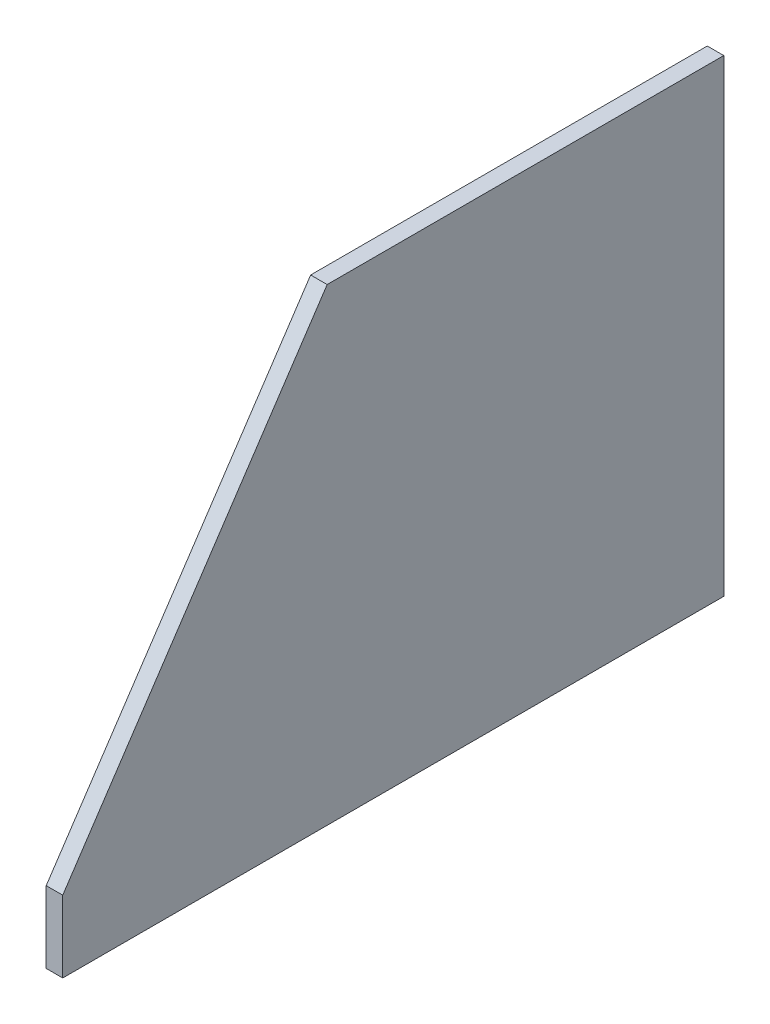
ISO-10303-21;
HEADER;
FILE_DESCRIPTION(('STEP AP214'),'2;1');
FILE_NAME('part.step','',(''),(''),'','','');
FILE_SCHEMA(('AUTOMOTIVE_DESIGN { 1 0 10303 214 1 1 1 1 }'));
ENDSEC;
DATA;
#1=APPLICATION_CONTEXT('core data for automotive mechanical design processes');
#2=APPLICATION_PROTOCOL_DEFINITION('international standard','automotive_design',2000,#1);
#3=PRODUCT_CONTEXT('',#1,'mechanical');
#4=PRODUCT('Part','Part','',(#3));
#5=PRODUCT_RELATED_PRODUCT_CATEGORY('part','',(#4));
#6=PRODUCT_DEFINITION_FORMATION('','',#4);
#7=PRODUCT_DEFINITION_CONTEXT('part definition',#1,'design');
#8=PRODUCT_DEFINITION('design','',#6,#7);
#9=PRODUCT_DEFINITION_SHAPE('','',#8);
#10=(LENGTH_UNIT() NAMED_UNIT(*) SI_UNIT(.MILLI.,.METRE.));
#11=(NAMED_UNIT(*) PLANE_ANGLE_UNIT() SI_UNIT($,.RADIAN.));
#12=(NAMED_UNIT(*) SI_UNIT($,.STERADIAN.) SOLID_ANGLE_UNIT());
#13=UNCERTAINTY_MEASURE_WITH_UNIT(LENGTH_MEASURE(1.E-05),#10,'distance_accuracy_value','');
#14=(GEOMETRIC_REPRESENTATION_CONTEXT(3) GLOBAL_UNCERTAINTY_ASSIGNED_CONTEXT((#13)) GLOBAL_UNIT_ASSIGNED_CONTEXT((#10,
#11,#12)) REPRESENTATION_CONTEXT('',''));
#15=CARTESIAN_POINT('',(0.,0.,0.));
#16=DIRECTION('',(0.,0.,1.));
#17=DIRECTION('',(1.,0.,0.));
#18=AXIS2_PLACEMENT_3D('',#15,#16,#17);
#19=CARTESIAN_POINT('',(6.35,0.,0.));
#20=DIRECTION('',(0.,0.,-1.));
#21=DIRECTION('',(0.,1.,0.));
#22=AXIS2_PLACEMENT_3D('',#19,#20,#21);
#23=PLANE('',#22);
#24=DIRECTION('',(0.,-1.,0.));
#25=VECTOR('',#24,1.);
#26=CARTESIAN_POINT('',(0.,0.,0.));
#27=LINE('',#26,#25);
#28=CARTESIAN_POINT('',(0.,152.4,0.));
#29=VERTEX_POINT('',#28);
#30=CARTESIAN_POINT('',(0.,-27.559,0.));
#31=VERTEX_POINT('',#30);
#32=EDGE_CURVE('E109',#29,#31,#27,.T.);
#33=ORIENTED_EDGE('',*,*,#32,.F.);
#34=DIRECTION('',(-1.,0.,0.));
#35=VECTOR('',#34,1.);
#36=CARTESIAN_POINT('',(6.35,152.4,0.));
#37=LINE('',#36,#35);
#38=CARTESIAN_POINT('',(6.35,152.4,0.));
#39=VERTEX_POINT('',#38);
#40=EDGE_CURVE('E11',#39,#29,#37,.T.);
#41=ORIENTED_EDGE('',*,*,#40,.F.);
#42=DIRECTION('',(0.,-1.,0.));
#43=VECTOR('',#42,1.);
#44=CARTESIAN_POINT('',(6.35,0.,0.));
#45=LINE('',#44,#43);
#46=CARTESIAN_POINT('',(6.35,-27.559,0.));
#47=VERTEX_POINT('',#46);
#48=EDGE_CURVE('E104',#39,#47,#45,.T.);
#49=ORIENTED_EDGE('',*,*,#48,.T.);
#50=DIRECTION('',(-1.,0.,0.));
#51=VECTOR('',#50,1.);
#52=CARTESIAN_POINT('',(6.35,-27.559,0.));
#53=LINE('',#52,#51);
#54=EDGE_CURVE('E76',#47,#31,#53,.T.);
#55=ORIENTED_EDGE('',*,*,#54,.T.);
#56=EDGE_LOOP('',(#33,#41,#49,#55));
#57=FACE_BOUND('',#56,.T.);
#58=ADVANCED_FACE('F35',(#57),#23,.T.);
#59=CARTESIAN_POINT('',(6.35,152.4,0.));
#60=DIRECTION('',(0.,1.,0.));
#61=DIRECTION('',(0.,0.,1.));
#62=AXIS2_PLACEMENT_3D('',#59,#60,#61);
#63=PLANE('',#62);
#64=DIRECTION('',(0.,0.,-1.));
#65=VECTOR('',#64,1.);
#66=CARTESIAN_POINT('',(0.,152.4,0.));
#67=LINE('',#66,#65);
#68=CARTESIAN_POINT('',(0.,152.4,152.4));
#69=VERTEX_POINT('',#68);
#70=EDGE_CURVE('E112',#69,#29,#67,.T.);
#71=ORIENTED_EDGE('',*,*,#70,.F.);
#72=DIRECTION('',(-1.,0.,0.));
#73=VECTOR('',#72,1.);
#74=CARTESIAN_POINT('',(6.35,152.4,152.4));
#75=LINE('',#74,#73);
#76=CARTESIAN_POINT('',(6.35,152.4,152.4));
#77=VERTEX_POINT('',#76);
#78=EDGE_CURVE('E43',#77,#69,#75,.T.);
#79=ORIENTED_EDGE('',*,*,#78,.F.);
#80=DIRECTION('',(0.,0.,-1.));
#81=VECTOR('',#80,1.);
#82=CARTESIAN_POINT('',(6.35,152.4,0.));
#83=LINE('',#82,#81);
#84=EDGE_CURVE('E102',#77,#39,#83,.T.);
#85=ORIENTED_EDGE('',*,*,#84,.T.);
#86=ORIENTED_EDGE('',*,*,#40,.T.);
#87=EDGE_LOOP('',(#71,#79,#85,#86));
#88=FACE_BOUND('',#87,.T.);
#89=ADVANCED_FACE('F122',(#88),#63,.T.);
#90=CARTESIAN_POINT('',(6.35,117.230769230769,175.846153846154));
#91=DIRECTION('',(0.,0.554700196225229,0.832050294337844));
#92=DIRECTION('',(0.,-0.832050294337844,0.554700196225229));
#93=AXIS2_PLACEMENT_3D('',#90,#91,#92);
#94=PLANE('',#93);
#95=DIRECTION('',(0.,0.832050294337844,-0.554700196225229));
#96=VECTOR('',#95,1.);
#97=CARTESIAN_POINT('',(0.,117.230769230769,175.846153846154));
#98=LINE('',#97,#96);
#99=CARTESIAN_POINT('',(0.,0.,254.));
#100=VERTEX_POINT('',#99);
#101=EDGE_CURVE('E93',#100,#69,#98,.T.);
#102=ORIENTED_EDGE('',*,*,#101,.F.);
#103=DIRECTION('',(-1.,0.,0.));
#104=VECTOR('',#103,1.);
#105=CARTESIAN_POINT('',(6.35,0.,254.));
#106=LINE('',#105,#104);
#107=CARTESIAN_POINT('',(6.35,0.,254.));
#108=VERTEX_POINT('',#107);
#109=EDGE_CURVE('E87',#108,#100,#106,.T.);
#110=ORIENTED_EDGE('',*,*,#109,.F.);
#111=DIRECTION('',(0.,0.832050294337844,-0.554700196225229));
#112=VECTOR('',#111,1.);
#113=CARTESIAN_POINT('',(6.35,117.230769230769,175.846153846154));
#114=LINE('',#113,#112);
#115=EDGE_CURVE('E91',#108,#77,#114,.T.);
#116=ORIENTED_EDGE('',*,*,#115,.T.);
#117=ORIENTED_EDGE('',*,*,#78,.T.);
#118=EDGE_LOOP('',(#102,#110,#116,#117));
#119=FACE_BOUND('',#118,.T.);
#120=ADVANCED_FACE('F89',(#119),#94,.T.);
#121=CARTESIAN_POINT('',(6.35,0.,254.));
#122=DIRECTION('',(0.,0.,-1.));
#123=DIRECTION('',(-1.,0.,0.));
#124=AXIS2_PLACEMENT_3D('',#121,#122,#123);
#125=PLANE('',#124);
#126=DIRECTION('',(0.,-1.,0.));
#127=VECTOR('',#126,1.);
#128=CARTESIAN_POINT('',(0.,0.,254.));
#129=LINE('',#128,#127);
#130=CARTESIAN_POINT('',(0.,-27.559,254.));
#131=VERTEX_POINT('',#130);
#132=EDGE_CURVE('E69',#100,#131,#129,.T.);
#133=ORIENTED_EDGE('',*,*,#132,.T.);
#134=DIRECTION('',(-1.,0.,0.));
#135=VECTOR('',#134,1.);
#136=CARTESIAN_POINT('',(6.35,-27.559,254.));
#137=LINE('',#136,#135);
#138=CARTESIAN_POINT('',(6.35,-27.559,254.));
#139=VERTEX_POINT('',#138);
#140=EDGE_CURVE('E94',#139,#131,#137,.T.);
#141=ORIENTED_EDGE('',*,*,#140,.F.);
#142=DIRECTION('',(0.,-1.,0.));
#143=VECTOR('',#142,1.);
#144=CARTESIAN_POINT('',(6.35,0.,254.));
#145=LINE('',#144,#143);
#146=EDGE_CURVE('E96',#108,#139,#145,.T.);
#147=ORIENTED_EDGE('',*,*,#146,.F.);
#148=ORIENTED_EDGE('',*,*,#109,.T.);
#149=EDGE_LOOP('',(#133,#141,#147,#148));
#150=FACE_BOUND('',#149,.T.);
#151=ADVANCED_FACE('F97',(#150),#125,.F.);
#152=CARTESIAN_POINT('',(6.35,-27.559,0.));
#153=DIRECTION('',(0.,1.,0.));
#154=DIRECTION('',(0.,0.,1.));
#155=AXIS2_PLACEMENT_3D('',#152,#153,#154);
#156=PLANE('',#155);
#157=DIRECTION('',(0.,0.,-1.));
#158=VECTOR('',#157,1.);
#159=CARTESIAN_POINT('',(0.,-27.559,0.));
#160=LINE('',#159,#158);
#161=EDGE_CURVE('E117',#131,#31,#160,.T.);
#162=ORIENTED_EDGE('',*,*,#161,.T.);
#163=ORIENTED_EDGE('',*,*,#54,.F.);
#164=DIRECTION('',(0.,0.,-1.));
#165=VECTOR('',#164,1.);
#166=CARTESIAN_POINT('',(6.35,-27.559,0.));
#167=LINE('',#166,#165);
#168=EDGE_CURVE('E51',#139,#47,#167,.T.);
#169=ORIENTED_EDGE('',*,*,#168,.F.);
#170=ORIENTED_EDGE('',*,*,#140,.T.);
#171=EDGE_LOOP('',(#162,#163,#169,#170));
#172=FACE_BOUND('',#171,.T.);
#173=ADVANCED_FACE('F127',(#172),#156,.F.);
#174=CARTESIAN_POINT('',(6.35,0.,0.));
#175=DIRECTION('',(1.,0.,0.));
#176=DIRECTION('',(0.,0.,-1.));
#177=AXIS2_PLACEMENT_3D('',#174,#175,#176);
#178=PLANE('',#177);
#179=ORIENTED_EDGE('',*,*,#48,.F.);
#180=ORIENTED_EDGE('',*,*,#84,.F.);
#181=ORIENTED_EDGE('',*,*,#115,.F.);
#182=ORIENTED_EDGE('',*,*,#146,.T.);
#183=ORIENTED_EDGE('',*,*,#168,.T.);
#184=EDGE_LOOP('',(#179,#180,#181,#182,#183));
#185=FACE_BOUND('',#184,.T.);
#186=ADVANCED_FACE('F100',(#185),#178,.T.);
#187=CARTESIAN_POINT('',(0.,0.,0.));
#188=DIRECTION('',(1.,0.,0.));
#189=DIRECTION('',(0.,0.,-1.));
#190=AXIS2_PLACEMENT_3D('',#187,#188,#189);
#191=PLANE('',#190);
#192=ORIENTED_EDGE('',*,*,#32,.T.);
#193=ORIENTED_EDGE('',*,*,#161,.F.);
#194=ORIENTED_EDGE('',*,*,#132,.F.);
#195=ORIENTED_EDGE('',*,*,#101,.T.);
#196=ORIENTED_EDGE('',*,*,#70,.T.);
#197=EDGE_LOOP('',(#192,#193,#194,#195,#196));
#198=FACE_BOUND('',#197,.T.);
#199=ADVANCED_FACE('F124',(#198),#191,.F.);
#200=CLOSED_SHELL('',(#58,#89,#120,#151,#173,#186,#199));
#201=MANIFOLD_SOLID_BREP('B2',#200);
#202=ADVANCED_BREP_SHAPE_REPRESENTATION('',(#18,#201),#14);
#203=SHAPE_DEFINITION_REPRESENTATION(#9,#202);
ENDSEC;
END-ISO-10303-21;
